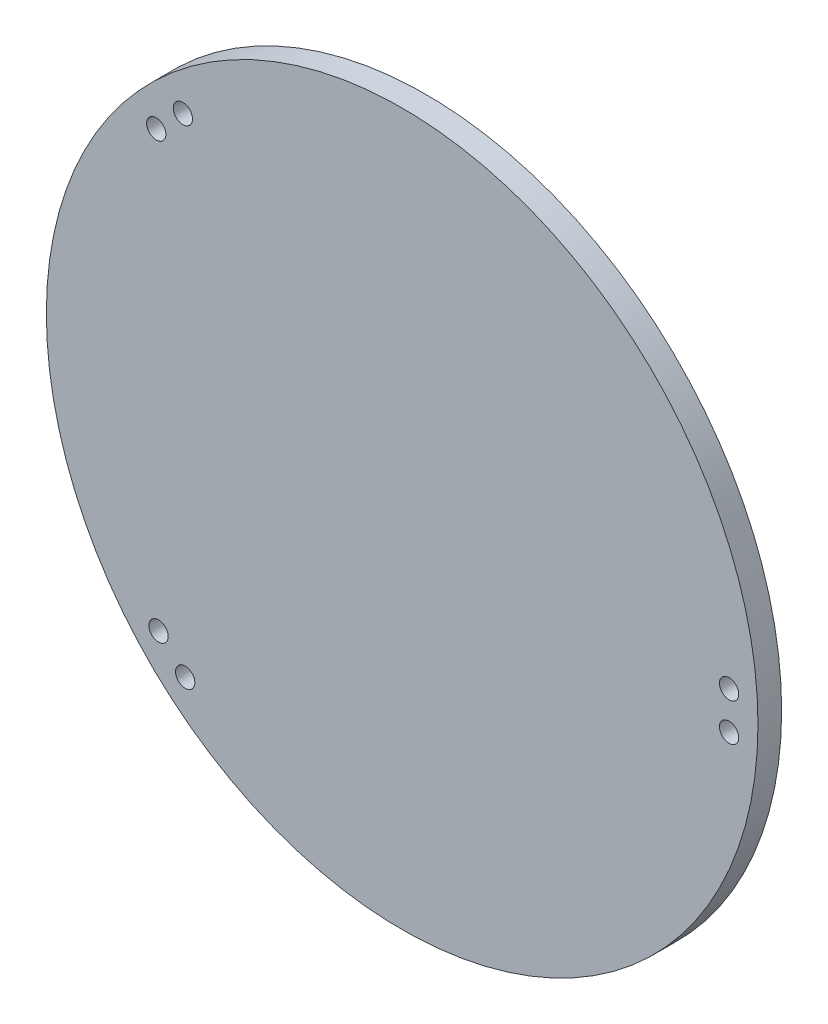
ISO-10303-21;
HEADER;
FILE_DESCRIPTION(('STEP AP214'),'2;1');
FILE_NAME('part.step','',(''),(''),'','','');
FILE_SCHEMA(('AUTOMOTIVE_DESIGN { 1 0 10303 214 1 1 1 1 }'));
ENDSEC;
DATA;
#1=APPLICATION_CONTEXT('core data for automotive mechanical design processes');
#2=APPLICATION_PROTOCOL_DEFINITION('international standard','automotive_design',2000,#1);
#3=PRODUCT_CONTEXT('',#1,'mechanical');
#4=PRODUCT('Part','Part','',(#3));
#5=PRODUCT_RELATED_PRODUCT_CATEGORY('part','',(#4));
#6=PRODUCT_DEFINITION_FORMATION('','',#4);
#7=PRODUCT_DEFINITION_CONTEXT('part definition',#1,'design');
#8=PRODUCT_DEFINITION('design','',#6,#7);
#9=PRODUCT_DEFINITION_SHAPE('','',#8);
#10=(LENGTH_UNIT() NAMED_UNIT(*) SI_UNIT(.MILLI.,.METRE.));
#11=(NAMED_UNIT(*) PLANE_ANGLE_UNIT() SI_UNIT($,.RADIAN.));
#12=(NAMED_UNIT(*) SI_UNIT($,.STERADIAN.) SOLID_ANGLE_UNIT());
#13=UNCERTAINTY_MEASURE_WITH_UNIT(LENGTH_MEASURE(1.E-05),#10,'distance_accuracy_value','');
#14=(GEOMETRIC_REPRESENTATION_CONTEXT(3) GLOBAL_UNCERTAINTY_ASSIGNED_CONTEXT((#13)) GLOBAL_UNIT_ASSIGNED_CONTEXT((#10,
#11,#12)) REPRESENTATION_CONTEXT('',''));
#15=CARTESIAN_POINT('',(0.,0.,0.));
#16=DIRECTION('',(0.,0.,1.));
#17=DIRECTION('',(1.,0.,0.));
#18=AXIS2_PLACEMENT_3D('',#15,#16,#17);
#19=CARTESIAN_POINT('',(82.75,82.324996948242,-5.39843884000001));
#20=DIRECTION('',(0.,0.,1.));
#21=DIRECTION('',(-0.59627763535291,0.802778289179486,0.));
#22=AXIS2_PLACEMENT_3D('',#19,#20,#21);
#23=CYLINDRICAL_SURFACE('',#22,2.8);
#24=CARTESIAN_POINT('',(82.75,82.324996948242,-0.798438840000012));
#25=DIRECTION('',(0.,0.,-1.));
#26=DIRECTION('',(0.59627763535291,-0.802778289179486,0.));
#27=AXIS2_PLACEMENT_3D('',#24,#25,#26);
#28=CIRCLE('',#27,2.8);
#29=CARTESIAN_POINT('',(84.4195773789881,80.0772177385394,-0.798438840000012));
#30=VERTEX_POINT('',#29);
#31=EDGE_CURVE('P0_E10',#30,#30,#28,.T.);
#32=ORIENTED_EDGE('',*,*,#31,.T.);
#33=EDGE_LOOP('',(#32));
#34=FACE_BOUND('',#33,.T.);
#35=CARTESIAN_POINT('',(82.75,82.324996948242,-3.39843884000001));
#36=DIRECTION('',(0.,0.,-1.));
#37=DIRECTION('',(-1.,0.,0.));
#38=AXIS2_PLACEMENT_3D('',#35,#36,#37);
#39=CIRCLE('',#38,2.8);
#40=CARTESIAN_POINT('',(79.95,82.324996948242,-3.39843884000001));
#41=VERTEX_POINT('',#40);
#42=EDGE_CURVE('P0_E35',#41,#41,#39,.T.);
#43=ORIENTED_EDGE('',*,*,#42,.F.);
#44=EDGE_LOOP('',(#43));
#45=FACE_BOUND('',#44,.T.);
#46=ADVANCED_FACE('P0_F32',(#34,#45),#23,.T.);
#47=CARTESIAN_POINT('',(82.75,82.324996948242,-0.798438840000012));
#48=DIRECTION('',(0.,0.,-1.));
#49=DIRECTION('',(0.59627763535291,-0.802778289179486,0.));
#50=AXIS2_PLACEMENT_3D('',#47,#48,#49);
#51=PLANE('',#50);
#52=ORIENTED_EDGE('',*,*,#31,.F.);
#53=EDGE_LOOP('',(#52));
#54=FACE_BOUND('',#53,.T.);
#55=ADVANCED_FACE('P0_F47',(#54),#51,.F.);
#56=CARTESIAN_POINT('',(82.0571117349648,81.9206765638218,-3.39843884000001));
#57=DIRECTION('',(0.,0.,-1.));
#58=DIRECTION('',(-1.,0.,0.));
#59=AXIS2_PLACEMENT_3D('',#56,#57,#58);
#60=PLANE('',#59);
#61=ORIENTED_EDGE('',*,*,#42,.T.);
#62=EDGE_LOOP('',(#61));
#63=FACE_BOUND('',#62,.T.);
#64=ADVANCED_FACE('P0_F44',(#63),#60,.T.);
#65=CLOSED_SHELL('',(#46,#55,#64));
#66=MANIFOLD_SOLID_BREP('P0_B2',#65);
#67=CARTESIAN_POINT('',(102.75,82.324996948242,0.));
#68=DIRECTION('',(0.,0.,-1.));
#69=DIRECTION('',(0.,-1.,0.));
#70=AXIS2_PLACEMENT_3D('',#67,#68,#69);
#71=PLANE('',#70);
#72=CARTESIAN_POINT('',(101.77500092,81.60500316,0.));
#73=DIRECTION('',(0.,0.,1.));
#74=DIRECTION('',(1.,0.,0.));
#75=AXIS2_PLACEMENT_3D('',#72,#73,#74);
#76=CIRCLE('',#75,0.32500062);
#77=CARTESIAN_POINT('',(102.10000154,81.60500316,0.));
#78=VERTEX_POINT('',#77);
#79=EDGE_CURVE('P1_E27',#78,#78,#76,.T.);
#80=ORIENTED_EDGE('',*,*,#79,.F.);
#81=EDGE_LOOP('',(#80));
#82=FACE_BOUND('',#81,.T.);
#83=CARTESIAN_POINT('',(101.77500092,82.87500062,0.));
#84=DIRECTION('',(0.,0.,1.));
#85=DIRECTION('',(1.,0.,0.));
#86=AXIS2_PLACEMENT_3D('',#83,#84,#85);
#87=CIRCLE('',#86,0.32500062);
#88=CARTESIAN_POINT('',(102.10000154,82.87500062,0.));
#89=VERTEX_POINT('',#88);
#90=EDGE_CURVE('P1_E105',#89,#89,#87,.T.);
#91=ORIENTED_EDGE('',*,*,#90,.F.);
#92=EDGE_LOOP('',(#91));
#93=FACE_BOUND('',#92,.T.);
#94=CARTESIAN_POINT('',(83.43210898,74.04288976,0.));
#95=DIRECTION('',(0.,0.,1.));
#96=DIRECTION('',(1.,0.,0.));
#97=AXIS2_PLACEMENT_3D('',#94,#95,#96);
#98=CIRCLE('',#97,0.32500062);
#99=CARTESIAN_POINT('',(83.7571096,74.04288976,0.));
#100=VERTEX_POINT('',#99);
#101=EDGE_CURVE('P1_E117',#100,#100,#98,.T.);
#102=ORIENTED_EDGE('',*,*,#101,.F.);
#103=EDGE_LOOP('',(#102));
#104=FACE_BOUND('',#103,.T.);
#105=CARTESIAN_POINT('',(83.35513174,90.46591508,0.));
#106=DIRECTION('',(0.,0.,1.));
#107=DIRECTION('',(1.,0.,0.));
#108=AXIS2_PLACEMENT_3D('',#105,#106,#107);
#109=CIRCLE('',#108,0.32500062);
#110=CARTESIAN_POINT('',(83.68013236,90.46591508,0.));
#111=VERTEX_POINT('',#110);
#112=EDGE_CURVE('P1_E77',#111,#111,#109,.T.);
#113=ORIENTED_EDGE('',*,*,#112,.F.);
#114=EDGE_LOOP('',(#113));
#115=FACE_BOUND('',#114,.T.);
#116=CARTESIAN_POINT('',(82.45710712,89.56789046,0.));
#117=DIRECTION('',(0.,0.,1.));
#118=DIRECTION('',(1.,0.,0.));
#119=AXIS2_PLACEMENT_3D('',#116,#117,#118);
#120=CIRCLE('',#119,0.32500062);
#121=CARTESIAN_POINT('',(82.78210774,89.56789046,0.));
#122=VERTEX_POINT('',#121);
#123=EDGE_CURVE('P1_E143',#122,#122,#120,.T.);
#124=ORIENTED_EDGE('',*,*,#123,.F.);
#125=EDGE_LOOP('',(#124));
#126=FACE_BOUND('',#125,.T.);
#127=CARTESIAN_POINT('',(82.53408436,74.94091438,0.));
#128=DIRECTION('',(0.,0.,1.));
#129=DIRECTION('',(1.,0.,0.));
#130=AXIS2_PLACEMENT_3D('',#127,#128,#129);
#131=CIRCLE('',#130,0.32500062);
#132=CARTESIAN_POINT('',(82.85908498,74.94091438,0.));
#133=VERTEX_POINT('',#132);
#134=EDGE_CURVE('P1_E126',#133,#133,#131,.T.);
#135=ORIENTED_EDGE('',*,*,#134,.F.);
#136=EDGE_LOOP('',(#135));
#137=FACE_BOUND('',#136,.T.);
#138=CARTESIAN_POINT('',(90.75,82.324996948242,0.));
#139=DIRECTION('',(0.,0.,1.));
#140=DIRECTION('',(1.,0.,0.));
#141=AXIS2_PLACEMENT_3D('',#138,#139,#140);
#142=CIRCLE('',#141,12.);
#143=CARTESIAN_POINT('',(102.75,82.324996948242,0.));
#144=VERTEX_POINT('',#143);
#145=EDGE_CURVE('P1_E118',#144,#144,#142,.T.);
#146=ORIENTED_EDGE('',*,*,#145,.T.);
#147=EDGE_LOOP('',(#146));
#148=FACE_BOUND('',#147,.T.);
#149=ADVANCED_FACE('P1_F16',(#82,#93,#104,#115,#126,#137,#148),#71,.F.);
#150=CARTESIAN_POINT('',(102.75,82.324996948242,-0.79843884));
#151=DIRECTION('',(0.,0.,-1.));
#152=DIRECTION('',(0.,-1.,0.));
#153=AXIS2_PLACEMENT_3D('',#150,#151,#152);
#154=PLANE('',#153);
#155=CARTESIAN_POINT('',(101.77500092,81.60500316,-0.79843884));
#156=DIRECTION('',(0.,0.,1.));
#157=DIRECTION('',(1.,0.,0.));
#158=AXIS2_PLACEMENT_3D('',#155,#156,#157);
#159=CIRCLE('',#158,0.32500062);
#160=CARTESIAN_POINT('',(102.10000154,81.60500316,-0.79843884));
#161=VERTEX_POINT('',#160);
#162=EDGE_CURVE('P1_E11',#161,#161,#159,.T.);
#163=ORIENTED_EDGE('',*,*,#162,.T.);
#164=EDGE_LOOP('',(#163));
#165=FACE_BOUND('',#164,.T.);
#166=CARTESIAN_POINT('',(101.77500092,82.87500062,-0.79843884));
#167=DIRECTION('',(0.,0.,1.));
#168=DIRECTION('',(1.,0.,0.));
#169=AXIS2_PLACEMENT_3D('',#166,#167,#168);
#170=CIRCLE('',#169,0.32500062);
#171=CARTESIAN_POINT('',(102.10000154,82.87500062,-0.79843884));
#172=VERTEX_POINT('',#171);
#173=EDGE_CURVE('P1_E98',#172,#172,#170,.T.);
#174=ORIENTED_EDGE('',*,*,#173,.T.);
#175=EDGE_LOOP('',(#174));
#176=FACE_BOUND('',#175,.T.);
#177=CARTESIAN_POINT('',(83.43210898,74.04288976,-0.79843884));
#178=DIRECTION('',(0.,0.,1.));
#179=DIRECTION('',(1.,0.,0.));
#180=AXIS2_PLACEMENT_3D('',#177,#178,#179);
#181=CIRCLE('',#180,0.32500062);
#182=CARTESIAN_POINT('',(83.7571096,74.04288976,-0.79843884));
#183=VERTEX_POINT('',#182);
#184=EDGE_CURVE('P1_E86',#183,#183,#181,.T.);
#185=ORIENTED_EDGE('',*,*,#184,.T.);
#186=EDGE_LOOP('',(#185));
#187=FACE_BOUND('',#186,.T.);
#188=CARTESIAN_POINT('',(83.35513174,90.46591508,-0.79843884));
#189=DIRECTION('',(0.,0.,1.));
#190=DIRECTION('',(1.,0.,0.));
#191=AXIS2_PLACEMENT_3D('',#188,#189,#190);
#192=CIRCLE('',#191,0.32500062);
#193=CARTESIAN_POINT('',(83.68013236,90.46591508,-0.79843884));
#194=VERTEX_POINT('',#193);
#195=EDGE_CURVE('P1_E149',#194,#194,#192,.T.);
#196=ORIENTED_EDGE('',*,*,#195,.T.);
#197=EDGE_LOOP('',(#196));
#198=FACE_BOUND('',#197,.T.);
#199=CARTESIAN_POINT('',(82.45710712,89.56789046,-0.79843884));
#200=DIRECTION('',(0.,0.,1.));
#201=DIRECTION('',(1.,0.,0.));
#202=AXIS2_PLACEMENT_3D('',#199,#200,#201);
#203=CIRCLE('',#202,0.32500062);
#204=CARTESIAN_POINT('',(82.78210774,89.56789046,-0.79843884));
#205=VERTEX_POINT('',#204);
#206=EDGE_CURVE('P1_E132',#205,#205,#203,.T.);
#207=ORIENTED_EDGE('',*,*,#206,.T.);
#208=EDGE_LOOP('',(#207));
#209=FACE_BOUND('',#208,.T.);
#210=CARTESIAN_POINT('',(82.53408436,74.94091438,-0.79843884));
#211=DIRECTION('',(0.,0.,1.));
#212=DIRECTION('',(1.,0.,0.));
#213=AXIS2_PLACEMENT_3D('',#210,#211,#212);
#214=CIRCLE('',#213,0.32500062);
#215=CARTESIAN_POINT('',(82.85908498,74.94091438,-0.79843884));
#216=VERTEX_POINT('',#215);
#217=EDGE_CURVE('P1_E20',#216,#216,#214,.T.);
#218=ORIENTED_EDGE('',*,*,#217,.T.);
#219=EDGE_LOOP('',(#218));
#220=FACE_BOUND('',#219,.T.);
#221=CARTESIAN_POINT('',(90.75,82.324996948242,-0.79843884));
#222=DIRECTION('',(0.,0.,1.));
#223=DIRECTION('',(1.,0.,0.));
#224=AXIS2_PLACEMENT_3D('',#221,#222,#223);
#225=CIRCLE('',#224,12.);
#226=CARTESIAN_POINT('',(102.75,82.324996948242,-0.79843884));
#227=VERTEX_POINT('',#226);
#228=EDGE_CURVE('P1_E135',#227,#227,#225,.T.);
#229=ORIENTED_EDGE('',*,*,#228,.F.);
#230=EDGE_LOOP('',(#229));
#231=FACE_BOUND('',#230,.T.);
#232=ADVANCED_FACE('P1_F99',(#165,#176,#187,#198,#209,#220,#231),#154,.T.);
#233=CARTESIAN_POINT('',(101.77500092,81.60500316,-0.79843884));
#234=DIRECTION('',(0.,0.,-1.));
#235=DIRECTION('',(1.,0.,0.));
#236=AXIS2_PLACEMENT_3D('',#233,#234,#235);
#237=CYLINDRICAL_SURFACE('',#236,0.32500062);
#238=DIRECTION('',(0.,0.,1.));
#239=VECTOR('',#238,1.);
#240=CARTESIAN_POINT('',(102.10000154,81.60500316,-0.79843884));
#241=LINE('',#240,#239);
#242=EDGE_CURVE('P1_E104',#161,#78,#241,.T.);
#243=ORIENTED_EDGE('',*,*,#242,.T.);
#244=ORIENTED_EDGE('',*,*,#79,.T.);
#245=ORIENTED_EDGE('',*,*,#242,.F.);
#246=ORIENTED_EDGE('',*,*,#162,.F.);
#247=EDGE_LOOP('',(#243,#244,#245,#246));
#248=FACE_BOUND('',#247,.T.);
#249=ADVANCED_FACE('P1_F195',(#248),#237,.F.);
#250=CARTESIAN_POINT('',(101.77500092,82.87500062,-0.79843884));
#251=DIRECTION('',(0.,0.,-1.));
#252=DIRECTION('',(1.,0.,0.));
#253=AXIS2_PLACEMENT_3D('',#250,#251,#252);
#254=CYLINDRICAL_SURFACE('',#253,0.32500062);
#255=DIRECTION('',(0.,0.,1.));
#256=VECTOR('',#255,1.);
#257=CARTESIAN_POINT('',(102.10000154,82.87500062,-0.79843884));
#258=LINE('',#257,#256);
#259=EDGE_CURVE('P1_E113',#172,#89,#258,.T.);
#260=ORIENTED_EDGE('',*,*,#259,.T.);
#261=ORIENTED_EDGE('',*,*,#90,.T.);
#262=ORIENTED_EDGE('',*,*,#259,.F.);
#263=ORIENTED_EDGE('',*,*,#173,.F.);
#264=EDGE_LOOP('',(#260,#261,#262,#263));
#265=FACE_BOUND('',#264,.T.);
#266=ADVANCED_FACE('P1_F205',(#265),#254,.F.);
#267=CARTESIAN_POINT('',(83.43210898,74.04288976,-0.79843884));
#268=DIRECTION('',(0.,0.,-1.));
#269=DIRECTION('',(1.,0.,0.));
#270=AXIS2_PLACEMENT_3D('',#267,#268,#269);
#271=CYLINDRICAL_SURFACE('',#270,0.32500062);
#272=DIRECTION('',(0.,0.,1.));
#273=VECTOR('',#272,1.);
#274=CARTESIAN_POINT('',(83.7571096,74.04288976,-0.79843884));
#275=LINE('',#274,#273);
#276=EDGE_CURVE('P1_E151',#183,#100,#275,.T.);
#277=ORIENTED_EDGE('',*,*,#276,.T.);
#278=ORIENTED_EDGE('',*,*,#101,.T.);
#279=ORIENTED_EDGE('',*,*,#276,.F.);
#280=ORIENTED_EDGE('',*,*,#184,.F.);
#281=EDGE_LOOP('',(#277,#278,#279,#280));
#282=FACE_BOUND('',#281,.T.);
#283=ADVANCED_FACE('P1_F202',(#282),#271,.F.);
#284=CARTESIAN_POINT('',(83.35513174,90.46591508,-0.79843884));
#285=DIRECTION('',(0.,0.,-1.));
#286=DIRECTION('',(1.,0.,0.));
#287=AXIS2_PLACEMENT_3D('',#284,#285,#286);
#288=CYLINDRICAL_SURFACE('',#287,0.32500062);
#289=DIRECTION('',(0.,0.,1.));
#290=VECTOR('',#289,1.);
#291=CARTESIAN_POINT('',(83.68013236,90.46591508,-0.79843884));
#292=LINE('',#291,#290);
#293=EDGE_CURVE('P1_E129',#194,#111,#292,.T.);
#294=ORIENTED_EDGE('',*,*,#293,.T.);
#295=ORIENTED_EDGE('',*,*,#112,.T.);
#296=ORIENTED_EDGE('',*,*,#293,.F.);
#297=ORIENTED_EDGE('',*,*,#195,.F.);
#298=EDGE_LOOP('',(#294,#295,#296,#297));
#299=FACE_BOUND('',#298,.T.);
#300=ADVANCED_FACE('P1_F186',(#299),#288,.F.);
#301=CARTESIAN_POINT('',(82.45710712,89.56789046,-0.79843884));
#302=DIRECTION('',(0.,0.,-1.));
#303=DIRECTION('',(1.,0.,0.));
#304=AXIS2_PLACEMENT_3D('',#301,#302,#303);
#305=CYLINDRICAL_SURFACE('',#304,0.32500062);
#306=DIRECTION('',(0.,0.,1.));
#307=VECTOR('',#306,1.);
#308=CARTESIAN_POINT('',(82.78210774,89.56789046,-0.79843884));
#309=LINE('',#308,#307);
#310=EDGE_CURVE('P1_E147',#205,#122,#309,.T.);
#311=ORIENTED_EDGE('',*,*,#310,.T.);
#312=ORIENTED_EDGE('',*,*,#123,.T.);
#313=ORIENTED_EDGE('',*,*,#310,.F.);
#314=ORIENTED_EDGE('',*,*,#206,.F.);
#315=EDGE_LOOP('',(#311,#312,#313,#314));
#316=FACE_BOUND('',#315,.T.);
#317=ADVANCED_FACE('P1_F18',(#316),#305,.F.);
#318=CARTESIAN_POINT('',(82.53408436,74.94091438,-0.79843884));
#319=DIRECTION('',(0.,0.,-1.));
#320=DIRECTION('',(1.,0.,0.));
#321=AXIS2_PLACEMENT_3D('',#318,#319,#320);
#322=CYLINDRICAL_SURFACE('',#321,0.32500062);
#323=DIRECTION('',(0.,0.,1.));
#324=VECTOR('',#323,1.);
#325=CARTESIAN_POINT('',(82.85908498,74.94091438,-0.79843884));
#326=LINE('',#325,#324);
#327=EDGE_CURVE('P1_E121',#216,#133,#326,.T.);
#328=ORIENTED_EDGE('',*,*,#327,.T.);
#329=ORIENTED_EDGE('',*,*,#134,.T.);
#330=ORIENTED_EDGE('',*,*,#327,.F.);
#331=ORIENTED_EDGE('',*,*,#217,.F.);
#332=EDGE_LOOP('',(#328,#329,#330,#331));
#333=FACE_BOUND('',#332,.T.);
#334=ADVANCED_FACE('P1_F174',(#333),#322,.F.);
#335=CARTESIAN_POINT('',(90.75,82.324996948242,-0.79843884));
#336=DIRECTION('',(0.,0.,-1.));
#337=DIRECTION('',(1.,0.,0.));
#338=AXIS2_PLACEMENT_3D('',#335,#336,#337);
#339=CYLINDRICAL_SURFACE('',#338,12.);
#340=ORIENTED_EDGE('',*,*,#228,.T.);
#341=DIRECTION('',(0.,0.,1.));
#342=VECTOR('',#341,1.);
#343=CARTESIAN_POINT('',(102.75,82.324996948242,-0.79843884));
#344=LINE('',#343,#342);
#345=EDGE_CURVE('P1_E122',#227,#144,#344,.T.);
#346=ORIENTED_EDGE('',*,*,#345,.T.);
#347=ORIENTED_EDGE('',*,*,#145,.F.);
#348=ORIENTED_EDGE('',*,*,#345,.F.);
#349=EDGE_LOOP('',(#340,#346,#347,#348));
#350=FACE_BOUND('',#349,.T.);
#351=ADVANCED_FACE('P1_F176',(#350),#339,.T.);
#352=CLOSED_SHELL('',(#149,#232,#249,#266,#283,#300,#317,#334,#351));
#353=MANIFOLD_SOLID_BREP('P1_B1',#352);
#354=ADVANCED_BREP_SHAPE_REPRESENTATION('',(#18,#66,#353),#14);
#355=SHAPE_DEFINITION_REPRESENTATION(#9,#354);
ENDSEC;
END-ISO-10303-21;
